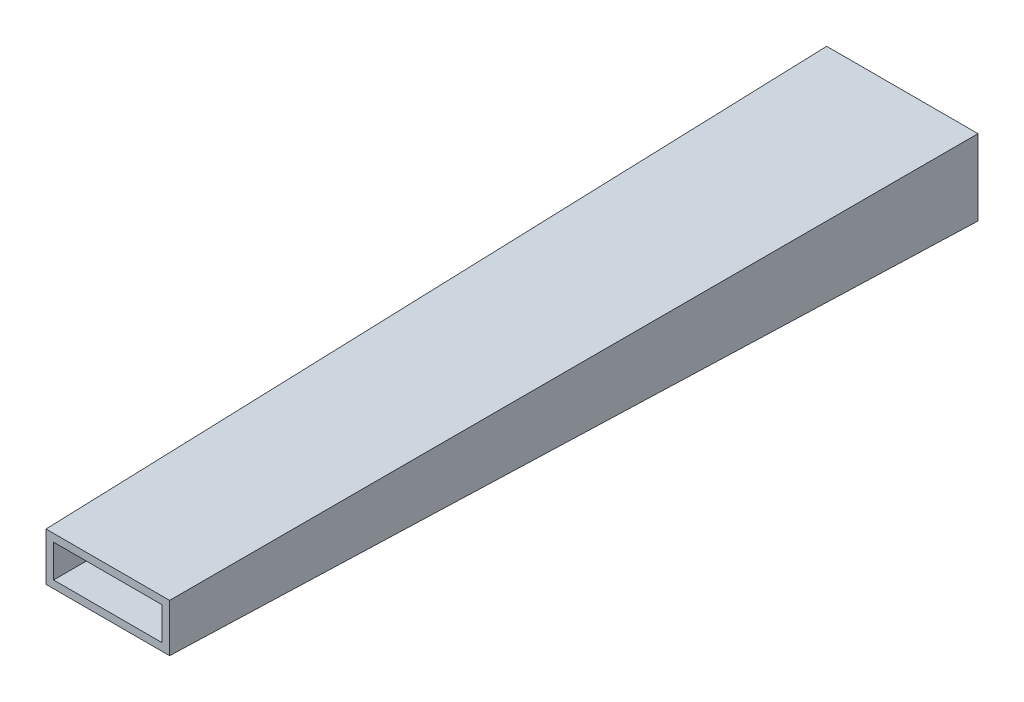
ISO-10303-21;
HEADER;
FILE_DESCRIPTION(('STEP AP214'),'2;1');
FILE_NAME('part.step','',(''),(''),'','','');
FILE_SCHEMA(('AUTOMOTIVE_DESIGN { 1 0 10303 214 1 1 1 1 }'));
ENDSEC;
DATA;
#1=APPLICATION_CONTEXT('core data for automotive mechanical design processes');
#2=APPLICATION_PROTOCOL_DEFINITION('international standard','automotive_design',2000,#1);
#3=PRODUCT_CONTEXT('',#1,'mechanical');
#4=PRODUCT('Part','Part','',(#3));
#5=PRODUCT_RELATED_PRODUCT_CATEGORY('part','',(#4));
#6=PRODUCT_DEFINITION_FORMATION('','',#4);
#7=PRODUCT_DEFINITION_CONTEXT('part definition',#1,'design');
#8=PRODUCT_DEFINITION('design','',#6,#7);
#9=PRODUCT_DEFINITION_SHAPE('','',#8);
#10=(LENGTH_UNIT() NAMED_UNIT(*) SI_UNIT(.MILLI.,.METRE.));
#11=(NAMED_UNIT(*) PLANE_ANGLE_UNIT() SI_UNIT($,.RADIAN.));
#12=(NAMED_UNIT(*) SI_UNIT($,.STERADIAN.) SOLID_ANGLE_UNIT());
#13=UNCERTAINTY_MEASURE_WITH_UNIT(LENGTH_MEASURE(1.E-05),#10,'distance_accuracy_value','');
#14=(GEOMETRIC_REPRESENTATION_CONTEXT(3) GLOBAL_UNCERTAINTY_ASSIGNED_CONTEXT((#13)) GLOBAL_UNIT_ASSIGNED_CONTEXT((#10,
#11,#12)) REPRESENTATION_CONTEXT('',''));
#15=CARTESIAN_POINT('',(0.,0.,0.));
#16=DIRECTION('',(0.,0.,1.));
#17=DIRECTION('',(1.,0.,0.));
#18=AXIS2_PLACEMENT_3D('',#15,#16,#17);
#19=CARTESIAN_POINT('',(100.,50.,0.));
#20=DIRECTION('',(0.999847695156391,0.,0.0174524064372835));
#21=DIRECTION('',(0.0174524064372835,0.,-0.999847695156391));
#22=AXIS2_PLACEMENT_3D('',#19,#20,#21);
#23=PLANE('',#22);
#24=DIRECTION('',(0.,1.,0.));
#25=VECTOR('',#24,1.);
#26=CARTESIAN_POINT('',(100.,50.,0.));
#27=LINE('',#26,#25);
#28=CARTESIAN_POINT('',(100.,-50.,0.));
#29=VERTEX_POINT('',#28);
#30=CARTESIAN_POINT('',(100.,50.,0.));
#31=VERTEX_POINT('',#30);
#32=EDGE_CURVE('E143',#29,#31,#27,.T.);
#33=ORIENTED_EDGE('',*,*,#32,.T.);
#34=DIRECTION('',(0.0174497491606827,0.0174497491606827,-0.999695459881887));
#35=VECTOR('',#34,1.);
#36=CARTESIAN_POINT('',(99.9391012508459,49.9391012508459,3.48888700240246));
#37=LINE('',#36,#35);
#38=CARTESIAN_POINT('',(81.6721818253715,31.6721818253715,1050.));
#39=VERTEX_POINT('',#38);
#40=EDGE_CURVE('E11',#39,#31,#37,.T.);
#41=ORIENTED_EDGE('',*,*,#40,.F.);
#42=DIRECTION('',(0.,-1.,0.));
#43=VECTOR('',#42,1.);
#44=CARTESIAN_POINT('',(81.6721818253715,50.,1050.));
#45=LINE('',#44,#43);
#46=CARTESIAN_POINT('',(81.6721818253715,-31.6721818253715,1050.));
#47=VERTEX_POINT('',#46);
#48=EDGE_CURVE('E151',#47,#39,#45,.F.);
#49=ORIENTED_EDGE('',*,*,#48,.F.);
#50=DIRECTION('',(0.0174497491606827,-0.0174497491606827,-0.999695459881888));
#51=VECTOR('',#50,1.);
#52=CARTESIAN_POINT('',(99.9695506254229,-49.9695506254229,1.74444350120123));
#53=LINE('',#52,#51);
#54=EDGE_CURVE('E153',#47,#29,#53,.T.);
#55=ORIENTED_EDGE('',*,*,#54,.T.);
#56=EDGE_LOOP('',(#33,#41,#49,#55));
#57=FACE_BOUND('',#56,.T.);
#58=ADVANCED_FACE('F43',(#57),#23,.T.);
#59=CARTESIAN_POINT('',(-100.,50.,0.));
#60=DIRECTION('',(0.,0.999847695156391,0.0174524064372835));
#61=DIRECTION('',(0.,-0.0174524064372835,0.999847695156391));
#62=AXIS2_PLACEMENT_3D('',#59,#60,#61);
#63=PLANE('',#62);
#64=DIRECTION('',(-1.,0.,0.));
#65=VECTOR('',#64,1.);
#66=CARTESIAN_POINT('',(-100.,50.,0.));
#67=LINE('',#66,#65);
#68=CARTESIAN_POINT('',(-100.,50.,0.));
#69=VERTEX_POINT('',#68);
#70=EDGE_CURVE('E146',#31,#69,#67,.T.);
#71=ORIENTED_EDGE('',*,*,#70,.T.);
#72=DIRECTION('',(-0.0174497491606827,0.0174497491606827,-0.999695459881887));
#73=VECTOR('',#72,1.);
#74=CARTESIAN_POINT('',(-100.,50.,0.));
#75=LINE('',#74,#73);
#76=CARTESIAN_POINT('',(-81.6721818253715,31.6721818253715,1050.));
#77=VERTEX_POINT('',#76);
#78=EDGE_CURVE('E52',#77,#69,#75,.T.);
#79=ORIENTED_EDGE('',*,*,#78,.F.);
#80=DIRECTION('',(1.,0.,0.));
#81=VECTOR('',#80,1.);
#82=CARTESIAN_POINT('',(-100.,31.6721818253715,1050.));
#83=LINE('',#82,#81);
#84=EDGE_CURVE('E163',#39,#77,#83,.F.);
#85=ORIENTED_EDGE('',*,*,#84,.F.);
#86=ORIENTED_EDGE('',*,*,#40,.T.);
#87=EDGE_LOOP('',(#71,#79,#85,#86));
#88=FACE_BOUND('',#87,.T.);
#89=ADVANCED_FACE('F45',(#88),#63,.T.);
#90=CARTESIAN_POINT('',(-100.,50.,0.));
#91=DIRECTION('',(-0.999847695156391,0.,0.0174524064372835));
#92=DIRECTION('',(0.0174524064372835,0.,0.999847695156391));
#93=AXIS2_PLACEMENT_3D('',#90,#91,#92);
#94=PLANE('',#93);
#95=DIRECTION('',(0.,-1.,0.));
#96=VECTOR('',#95,1.);
#97=CARTESIAN_POINT('',(-100.,50.,0.));
#98=LINE('',#97,#96);
#99=CARTESIAN_POINT('',(-100.,-50.,0.));
#100=VERTEX_POINT('',#99);
#101=EDGE_CURVE('E148',#69,#100,#98,.T.);
#102=ORIENTED_EDGE('',*,*,#101,.T.);
#103=DIRECTION('',(-0.0174497491606827,-0.0174497491606827,-0.999695459881888));
#104=VECTOR('',#103,1.);
#105=CARTESIAN_POINT('',(-100.,-50.,0.));
#106=LINE('',#105,#104);
#107=CARTESIAN_POINT('',(-81.6721818253715,-31.6721818253715,1050.));
#108=VERTEX_POINT('',#107);
#109=EDGE_CURVE('E156',#108,#100,#106,.T.);
#110=ORIENTED_EDGE('',*,*,#109,.F.);
#111=DIRECTION('',(0.,1.,0.));
#112=VECTOR('',#111,1.);
#113=CARTESIAN_POINT('',(-81.6721818253715,50.,1050.));
#114=LINE('',#113,#112);
#115=EDGE_CURVE('E164',#77,#108,#114,.F.);
#116=ORIENTED_EDGE('',*,*,#115,.F.);
#117=ORIENTED_EDGE('',*,*,#78,.T.);
#118=EDGE_LOOP('',(#102,#110,#116,#117));
#119=FACE_BOUND('',#118,.T.);
#120=ADVANCED_FACE('F182',(#119),#94,.T.);
#121=CARTESIAN_POINT('',(-100.,-50.,0.));
#122=DIRECTION('',(0.,-0.999847695156391,0.0174524064372835));
#123=DIRECTION('',(0.,-0.0174524064372836,-0.999847695156391));
#124=AXIS2_PLACEMENT_3D('',#121,#122,#123);
#125=PLANE('',#124);
#126=DIRECTION('',(1.,0.,0.));
#127=VECTOR('',#126,1.);
#128=CARTESIAN_POINT('',(-100.,-50.,0.));
#129=LINE('',#128,#127);
#130=EDGE_CURVE('E150',#100,#29,#129,.T.);
#131=ORIENTED_EDGE('',*,*,#130,.T.);
#132=ORIENTED_EDGE('',*,*,#54,.F.);
#133=DIRECTION('',(-1.,0.,0.));
#134=VECTOR('',#133,1.);
#135=CARTESIAN_POINT('',(-100.,-31.6721818253715,1050.));
#136=LINE('',#135,#134);
#137=EDGE_CURVE('E47',#108,#47,#136,.F.);
#138=ORIENTED_EDGE('',*,*,#137,.F.);
#139=ORIENTED_EDGE('',*,*,#109,.T.);
#140=EDGE_LOOP('',(#131,#132,#138,#139));
#141=FACE_BOUND('',#140,.T.);
#142=ADVANCED_FACE('F174',(#141),#125,.T.);
#143=CARTESIAN_POINT('',(0.,0.,1050.));
#144=DIRECTION('',(0.,0.,1.));
#145=DIRECTION('',(1.,0.,0.));
#146=AXIS2_PLACEMENT_3D('',#143,#144,#145);
#147=PLANE('',#146);
#148=DIRECTION('',(0.,-1.,0.));
#149=VECTOR('',#148,1.);
#150=CARTESIAN_POINT('',(71.6706585449324,50.,1050.));
#151=LINE('',#150,#149);
#152=CARTESIAN_POINT('',(71.6706585449324,-21.6706585449324,1050.));
#153=VERTEX_POINT('',#152);
#154=CARTESIAN_POINT('',(71.6706585449324,21.6706585449324,1050.));
#155=VERTEX_POINT('',#154);
#156=EDGE_CURVE('E131',#153,#155,#151,.F.);
#157=ORIENTED_EDGE('',*,*,#156,.F.);
#158=DIRECTION('',(-1.,0.,0.));
#159=VECTOR('',#158,1.);
#160=CARTESIAN_POINT('',(-100.,-21.6706585449324,1050.));
#161=LINE('',#160,#159);
#162=CARTESIAN_POINT('',(-71.6706585449324,-21.6706585449324,1050.));
#163=VERTEX_POINT('',#162);
#164=EDGE_CURVE('E115',#163,#153,#161,.F.);
#165=ORIENTED_EDGE('',*,*,#164,.F.);
#166=DIRECTION('',(0.,1.,0.));
#167=VECTOR('',#166,1.);
#168=CARTESIAN_POINT('',(-71.6706585449324,50.,1050.));
#169=LINE('',#168,#167);
#170=CARTESIAN_POINT('',(-71.6706585449324,21.6706585449324,1050.));
#171=VERTEX_POINT('',#170);
#172=EDGE_CURVE('E140',#171,#163,#169,.F.);
#173=ORIENTED_EDGE('',*,*,#172,.F.);
#174=DIRECTION('',(1.,0.,0.));
#175=VECTOR('',#174,1.);
#176=CARTESIAN_POINT('',(-100.,21.6706585449324,1050.));
#177=LINE('',#176,#175);
#178=EDGE_CURVE('E133',#155,#171,#177,.F.);
#179=ORIENTED_EDGE('',*,*,#178,.F.);
#180=EDGE_LOOP('',(#157,#165,#173,#179));
#181=FACE_BOUND('',#180,.T.);
#182=ORIENTED_EDGE('',*,*,#48,.T.);
#183=ORIENTED_EDGE('',*,*,#84,.T.);
#184=ORIENTED_EDGE('',*,*,#115,.T.);
#185=ORIENTED_EDGE('',*,*,#137,.T.);
#186=EDGE_LOOP('',(#182,#183,#184,#185));
#187=FACE_BOUND('',#186,.T.);
#188=ADVANCED_FACE('F170',(#181,#187),#147,.T.);
#189=CARTESIAN_POINT('',(0.,0.,0.));
#190=DIRECTION('',(0.,0.,1.));
#191=DIRECTION('',(1.,0.,0.));
#192=AXIS2_PLACEMENT_3D('',#189,#190,#191);
#193=PLANE('',#192);
#194=DIRECTION('',(-1.,0.,0.));
#195=VECTOR('',#194,1.);
#196=CARTESIAN_POINT('',(-100.,-39.9984767195609,0.));
#197=LINE('',#196,#195);
#198=CARTESIAN_POINT('',(-89.9984767195609,-39.9984767195609,0.));
#199=VERTEX_POINT('',#198);
#200=CARTESIAN_POINT('',(89.9984767195609,-39.9984767195609,0.));
#201=VERTEX_POINT('',#200);
#202=EDGE_CURVE('E113',#199,#201,#197,.F.);
#203=ORIENTED_EDGE('',*,*,#202,.T.);
#204=DIRECTION('',(0.,-1.,0.));
#205=VECTOR('',#204,1.);
#206=CARTESIAN_POINT('',(89.9984767195609,50.,0.));
#207=LINE('',#206,#205);
#208=CARTESIAN_POINT('',(89.9984767195609,39.9984767195609,0.));
#209=VERTEX_POINT('',#208);
#210=EDGE_CURVE('E121',#201,#209,#207,.F.);
#211=ORIENTED_EDGE('',*,*,#210,.T.);
#212=DIRECTION('',(1.,0.,0.));
#213=VECTOR('',#212,1.);
#214=CARTESIAN_POINT('',(-100.,39.9984767195609,0.));
#215=LINE('',#214,#213);
#216=CARTESIAN_POINT('',(-89.9984767195609,39.9984767195609,0.));
#217=VERTEX_POINT('',#216);
#218=EDGE_CURVE('E127',#209,#217,#215,.F.);
#219=ORIENTED_EDGE('',*,*,#218,.T.);
#220=DIRECTION('',(0.,1.,0.));
#221=VECTOR('',#220,1.);
#222=CARTESIAN_POINT('',(-89.9984767195609,50.,0.));
#223=LINE('',#222,#221);
#224=EDGE_CURVE('E67',#217,#199,#223,.F.);
#225=ORIENTED_EDGE('',*,*,#224,.T.);
#226=EDGE_LOOP('',(#203,#211,#219,#225));
#227=FACE_BOUND('',#226,.T.);
#228=ORIENTED_EDGE('',*,*,#32,.F.);
#229=ORIENTED_EDGE('',*,*,#130,.F.);
#230=ORIENTED_EDGE('',*,*,#101,.F.);
#231=ORIENTED_EDGE('',*,*,#70,.F.);
#232=EDGE_LOOP('',(#228,#229,#230,#231));
#233=FACE_BOUND('',#232,.T.);
#234=ADVANCED_FACE('F129',(#227,#233),#193,.F.);
#235=CARTESIAN_POINT('',(90.0015230484361,50.,-0.174524064372835));
#236=DIRECTION('',(0.999847695156391,0.,0.0174524064372835));
#237=DIRECTION('',(0.0174524064372835,0.,-0.999847695156391));
#238=AXIS2_PLACEMENT_3D('',#235,#236,#237);
#239=PLANE('',#238);
#240=ORIENTED_EDGE('',*,*,#210,.F.);
#241=DIRECTION('',(0.0174497491606827,-0.0174497491606827,-0.999695459881888));
#242=VECTOR('',#241,1.);
#243=CARTESIAN_POINT('',(89.974118147558,-39.974118147558,1.39550165542773));
#244=LINE('',#243,#242);
#245=EDGE_CURVE('E109',#153,#201,#244,.T.);
#246=ORIENTED_EDGE('',*,*,#245,.F.);
#247=ORIENTED_EDGE('',*,*,#156,.T.);
#248=DIRECTION('',(0.0174497491606827,0.0174497491606827,-0.999695459881887));
#249=VECTOR('',#248,1.);
#250=CARTESIAN_POINT('',(89.9436687729809,39.9436687729809,3.13994515662896));
#251=LINE('',#250,#249);
#252=EDGE_CURVE('E124',#155,#209,#251,.T.);
#253=ORIENTED_EDGE('',*,*,#252,.T.);
#254=EDGE_LOOP('',(#240,#246,#247,#253));
#255=FACE_BOUND('',#254,.T.);
#256=ADVANCED_FACE('F122',(#255),#239,.F.);
#257=CARTESIAN_POINT('',(-100.,40.0015230484361,-0.174524064372835));
#258=DIRECTION('',(0.,0.999847695156391,0.0174524064372835));
#259=DIRECTION('',(0.,-0.0174524064372835,0.999847695156391));
#260=AXIS2_PLACEMENT_3D('',#257,#258,#259);
#261=PLANE('',#260);
#262=ORIENTED_EDGE('',*,*,#218,.F.);
#263=ORIENTED_EDGE('',*,*,#252,.F.);
#264=ORIENTED_EDGE('',*,*,#178,.T.);
#265=DIRECTION('',(-0.0174497491606827,0.0174497491606827,-0.999695459881887));
#266=VECTOR('',#265,1.);
#267=CARTESIAN_POINT('',(-90.0045675221351,40.0045675221351,-0.348941845773495));
#268=LINE('',#267,#266);
#269=EDGE_CURVE('E256',#171,#217,#268,.T.);
#270=ORIENTED_EDGE('',*,*,#269,.T.);
#271=EDGE_LOOP('',(#262,#263,#264,#270));
#272=FACE_BOUND('',#271,.T.);
#273=ADVANCED_FACE('F189',(#272),#261,.F.);
#274=CARTESIAN_POINT('',(-90.0015230484361,50.,-0.174524064372835));
#275=DIRECTION('',(-0.999847695156391,0.,0.0174524064372835));
#276=DIRECTION('',(0.0174524064372835,0.,0.999847695156391));
#277=AXIS2_PLACEMENT_3D('',#274,#275,#276);
#278=PLANE('',#277);
#279=ORIENTED_EDGE('',*,*,#224,.F.);
#280=ORIENTED_EDGE('',*,*,#269,.F.);
#281=ORIENTED_EDGE('',*,*,#172,.T.);
#282=DIRECTION('',(-0.0174497491606827,-0.0174497491606827,-0.999695459881888));
#283=VECTOR('',#282,1.);
#284=CARTESIAN_POINT('',(-90.004567522135,-40.0045675221351,-0.348941845773495));
#285=LINE('',#284,#283);
#286=EDGE_CURVE('E60',#163,#199,#285,.T.);
#287=ORIENTED_EDGE('',*,*,#286,.T.);
#288=EDGE_LOOP('',(#279,#280,#281,#287));
#289=FACE_BOUND('',#288,.T.);
#290=ADVANCED_FACE('F234',(#289),#278,.F.);
#291=CARTESIAN_POINT('',(-100.,-40.0015230484361,-0.174524064372835));
#292=DIRECTION('',(0.,-0.999847695156391,0.0174524064372835));
#293=DIRECTION('',(0.,-0.0174524064372836,-0.999847695156391));
#294=AXIS2_PLACEMENT_3D('',#291,#292,#293);
#295=PLANE('',#294);
#296=ORIENTED_EDGE('',*,*,#202,.F.);
#297=ORIENTED_EDGE('',*,*,#286,.F.);
#298=ORIENTED_EDGE('',*,*,#164,.T.);
#299=ORIENTED_EDGE('',*,*,#245,.T.);
#300=EDGE_LOOP('',(#296,#297,#298,#299));
#301=FACE_BOUND('',#300,.T.);
#302=ADVANCED_FACE('F111',(#301),#295,.F.);
#303=CLOSED_SHELL('',(#58,#89,#120,#142,#188,#234,#256,#273,#290,#302));
#304=MANIFOLD_SOLID_BREP('B2',#303);
#305=ADVANCED_BREP_SHAPE_REPRESENTATION('',(#18,#304),#14);
#306=SHAPE_DEFINITION_REPRESENTATION(#9,#305);
ENDSEC;
END-ISO-10303-21;
